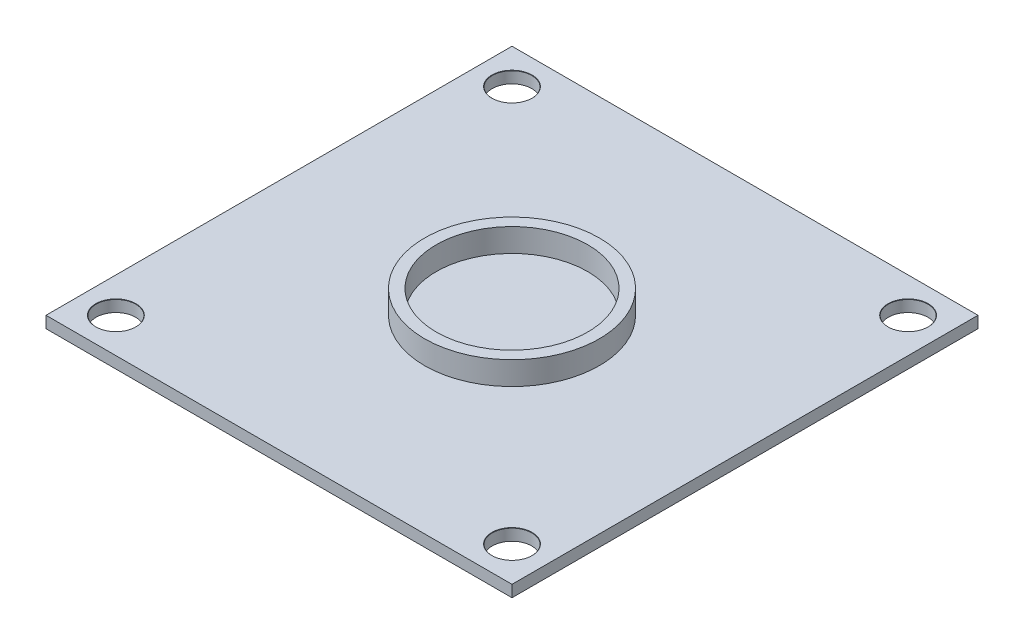
ISO-10303-21;
HEADER;
FILE_DESCRIPTION(('STEP AP214'),'2;1');
FILE_NAME('part.step','',(''),(''),'','','');
FILE_SCHEMA(('AUTOMOTIVE_DESIGN { 1 0 10303 214 1 1 1 1 }'));
ENDSEC;
DATA;
#1=APPLICATION_CONTEXT('core data for automotive mechanical design processes');
#2=APPLICATION_PROTOCOL_DEFINITION('international standard','automotive_design',2000,#1);
#3=PRODUCT_CONTEXT('',#1,'mechanical');
#4=PRODUCT('Part','Part','',(#3));
#5=PRODUCT_RELATED_PRODUCT_CATEGORY('part','',(#4));
#6=PRODUCT_DEFINITION_FORMATION('','',#4);
#7=PRODUCT_DEFINITION_CONTEXT('part definition',#1,'design');
#8=PRODUCT_DEFINITION('design','',#6,#7);
#9=PRODUCT_DEFINITION_SHAPE('','',#8);
#10=(LENGTH_UNIT() NAMED_UNIT(*) SI_UNIT(.MILLI.,.METRE.));
#11=(NAMED_UNIT(*) PLANE_ANGLE_UNIT() SI_UNIT($,.RADIAN.));
#12=(NAMED_UNIT(*) SI_UNIT($,.STERADIAN.) SOLID_ANGLE_UNIT());
#13=UNCERTAINTY_MEASURE_WITH_UNIT(LENGTH_MEASURE(1.E-05),#10,'distance_accuracy_value','');
#14=(GEOMETRIC_REPRESENTATION_CONTEXT(3) GLOBAL_UNCERTAINTY_ASSIGNED_CONTEXT((#13)) GLOBAL_UNIT_ASSIGNED_CONTEXT((#10,
#11,#12)) REPRESENTATION_CONTEXT('',''));
#15=CARTESIAN_POINT('',(0.,0.,0.));
#16=DIRECTION('',(0.,0.,1.));
#17=DIRECTION('',(1.,0.,0.));
#18=AXIS2_PLACEMENT_3D('',#15,#16,#17);
#19=CARTESIAN_POINT('',(0.,1.,0.));
#20=DIRECTION('',(1.,0.,0.));
#21=DIRECTION('',(0.,0.,-1.));
#22=AXIS2_PLACEMENT_3D('',#19,#20,#21);
#23=PLANE('',#22);
#24=DIRECTION('',(0.,0.,1.));
#25=VECTOR('',#24,1.);
#26=CARTESIAN_POINT('',(0.,0.,0.));
#27=LINE('',#26,#25);
#28=CARTESIAN_POINT('',(0.,0.,-40.));
#29=VERTEX_POINT('',#28);
#30=CARTESIAN_POINT('',(0.,0.,0.));
#31=VERTEX_POINT('',#30);
#32=EDGE_CURVE('E112',#29,#31,#27,.T.);
#33=ORIENTED_EDGE('',*,*,#32,.T.);
#34=DIRECTION('',(0.,-1.,0.));
#35=VECTOR('',#34,1.);
#36=CARTESIAN_POINT('',(0.,1.,0.));
#37=LINE('',#36,#35);
#38=CARTESIAN_POINT('',(0.,1.,0.));
#39=VERTEX_POINT('',#38);
#40=EDGE_CURVE('E50',#39,#31,#37,.T.);
#41=ORIENTED_EDGE('',*,*,#40,.F.);
#42=DIRECTION('',(0.,0.,1.));
#43=VECTOR('',#42,1.);
#44=CARTESIAN_POINT('',(0.,1.,0.));
#45=LINE('',#44,#43);
#46=CARTESIAN_POINT('',(0.,1.,-40.));
#47=VERTEX_POINT('',#46);
#48=EDGE_CURVE('E94',#47,#39,#45,.T.);
#49=ORIENTED_EDGE('',*,*,#48,.F.);
#50=DIRECTION('',(0.,-1.,0.));
#51=VECTOR('',#50,1.);
#52=CARTESIAN_POINT('',(0.,1.,-40.));
#53=LINE('',#52,#51);
#54=EDGE_CURVE('E108',#47,#29,#53,.T.);
#55=ORIENTED_EDGE('',*,*,#54,.T.);
#56=EDGE_LOOP('',(#33,#41,#49,#55));
#57=FACE_BOUND('',#56,.T.);
#58=ADVANCED_FACE('F41',(#57),#23,.F.);
#59=CARTESIAN_POINT('',(0.,1.,0.));
#60=DIRECTION('',(0.,0.,-1.));
#61=DIRECTION('',(-1.,0.,0.));
#62=AXIS2_PLACEMENT_3D('',#59,#60,#61);
#63=PLANE('',#62);
#64=DIRECTION('',(1.,0.,0.));
#65=VECTOR('',#64,1.);
#66=CARTESIAN_POINT('',(0.,0.,0.));
#67=LINE('',#66,#65);
#68=CARTESIAN_POINT('',(40.,0.,0.));
#69=VERTEX_POINT('',#68);
#70=EDGE_CURVE('E100',#31,#69,#67,.T.);
#71=ORIENTED_EDGE('',*,*,#70,.T.);
#72=DIRECTION('',(0.,-1.,0.));
#73=VECTOR('',#72,1.);
#74=CARTESIAN_POINT('',(40.,1.,0.));
#75=LINE('',#74,#73);
#76=CARTESIAN_POINT('',(40.,1.,0.));
#77=VERTEX_POINT('',#76);
#78=EDGE_CURVE('E98',#77,#69,#75,.T.);
#79=ORIENTED_EDGE('',*,*,#78,.F.);
#80=DIRECTION('',(1.,0.,0.));
#81=VECTOR('',#80,1.);
#82=CARTESIAN_POINT('',(0.,1.,0.));
#83=LINE('',#82,#81);
#84=EDGE_CURVE('E89',#39,#77,#83,.T.);
#85=ORIENTED_EDGE('',*,*,#84,.F.);
#86=ORIENTED_EDGE('',*,*,#40,.T.);
#87=EDGE_LOOP('',(#71,#79,#85,#86));
#88=FACE_BOUND('',#87,.T.);
#89=ADVANCED_FACE('F99',(#88),#63,.F.);
#90=CARTESIAN_POINT('',(40.,1.,0.));
#91=DIRECTION('',(-1.,0.,0.));
#92=DIRECTION('',(0.,0.,1.));
#93=AXIS2_PLACEMENT_3D('',#90,#91,#92);
#94=PLANE('',#93);
#95=DIRECTION('',(0.,0.,-1.));
#96=VECTOR('',#95,1.);
#97=CARTESIAN_POINT('',(40.,0.,0.));
#98=LINE('',#97,#96);
#99=CARTESIAN_POINT('',(40.,0.,-40.));
#100=VERTEX_POINT('',#99);
#101=EDGE_CURVE('E75',#69,#100,#98,.T.);
#102=ORIENTED_EDGE('',*,*,#101,.T.);
#103=DIRECTION('',(0.,-1.,0.));
#104=VECTOR('',#103,1.);
#105=CARTESIAN_POINT('',(40.,1.,-40.));
#106=LINE('',#105,#104);
#107=CARTESIAN_POINT('',(40.,1.,-40.));
#108=VERTEX_POINT('',#107);
#109=EDGE_CURVE('E102',#108,#100,#106,.T.);
#110=ORIENTED_EDGE('',*,*,#109,.F.);
#111=DIRECTION('',(0.,0.,-1.));
#112=VECTOR('',#111,1.);
#113=CARTESIAN_POINT('',(40.,1.,0.));
#114=LINE('',#113,#112);
#115=EDGE_CURVE('E92',#77,#108,#114,.T.);
#116=ORIENTED_EDGE('',*,*,#115,.F.);
#117=ORIENTED_EDGE('',*,*,#78,.T.);
#118=EDGE_LOOP('',(#102,#110,#116,#117));
#119=FACE_BOUND('',#118,.T.);
#120=ADVANCED_FACE('F104',(#119),#94,.F.);
#121=CARTESIAN_POINT('',(0.,1.,-40.));
#122=DIRECTION('',(0.,0.,1.));
#123=DIRECTION('',(1.,0.,0.));
#124=AXIS2_PLACEMENT_3D('',#121,#122,#123);
#125=PLANE('',#124);
#126=DIRECTION('',(-1.,0.,0.));
#127=VECTOR('',#126,1.);
#128=CARTESIAN_POINT('',(0.,0.,-40.));
#129=LINE('',#128,#127);
#130=EDGE_CURVE('E81',#100,#29,#129,.T.);
#131=ORIENTED_EDGE('',*,*,#130,.T.);
#132=ORIENTED_EDGE('',*,*,#54,.F.);
#133=DIRECTION('',(-1.,0.,0.));
#134=VECTOR('',#133,1.);
#135=CARTESIAN_POINT('',(0.,1.,-40.));
#136=LINE('',#135,#134);
#137=EDGE_CURVE('E58',#108,#47,#136,.T.);
#138=ORIENTED_EDGE('',*,*,#137,.F.);
#139=ORIENTED_EDGE('',*,*,#109,.T.);
#140=EDGE_LOOP('',(#131,#132,#138,#139));
#141=FACE_BOUND('',#140,.T.);
#142=ADVANCED_FACE('F142',(#141),#125,.F.);
#143=CARTESIAN_POINT('',(0.,1.,0.));
#144=DIRECTION('',(0.,-1.,0.));
#145=DIRECTION('',(0.,0.,-1.));
#146=AXIS2_PLACEMENT_3D('',#143,#144,#145);
#147=PLANE('',#146);
#148=CARTESIAN_POINT('',(3.,1.,-3.));
#149=DIRECTION('',(0.,1.,0.));
#150=DIRECTION('',(0.,0.,1.));
#151=AXIS2_PLACEMENT_3D('',#148,#149,#150);
#152=CIRCLE('',#151,1.725);
#153=CARTESIAN_POINT('',(3.,1.,-1.275));
#154=VERTEX_POINT('',#153);
#155=EDGE_CURVE('E332',#154,#154,#152,.T.);
#156=ORIENTED_EDGE('',*,*,#155,.F.);
#157=EDGE_LOOP('',(#156));
#158=FACE_BOUND('',#157,.T.);
#159=CARTESIAN_POINT('',(2.99999999999998,1.,-37.));
#160=DIRECTION('',(0.,1.,0.));
#161=DIRECTION('',(0.,0.,1.));
#162=AXIS2_PLACEMENT_3D('',#159,#160,#161);
#163=CIRCLE('',#162,1.725);
#164=CARTESIAN_POINT('',(2.99999999999998,1.,-35.275));
#165=VERTEX_POINT('',#164);
#166=EDGE_CURVE('E321',#165,#165,#163,.T.);
#167=ORIENTED_EDGE('',*,*,#166,.F.);
#168=EDGE_LOOP('',(#167));
#169=FACE_BOUND('',#168,.T.);
#170=CARTESIAN_POINT('',(37.,1.,-37.));
#171=DIRECTION('',(0.,1.,0.));
#172=DIRECTION('',(0.,0.,1.));
#173=AXIS2_PLACEMENT_3D('',#170,#171,#172);
#174=CIRCLE('',#173,1.725);
#175=CARTESIAN_POINT('',(37.,1.,-35.275));
#176=VERTEX_POINT('',#175);
#177=EDGE_CURVE('E309',#176,#176,#174,.T.);
#178=ORIENTED_EDGE('',*,*,#177,.F.);
#179=EDGE_LOOP('',(#178));
#180=FACE_BOUND('',#179,.T.);
#181=CARTESIAN_POINT('',(37.,1.,-3.00000000000002));
#182=DIRECTION('',(0.,1.,0.));
#183=DIRECTION('',(0.,0.,1.));
#184=AXIS2_PLACEMENT_3D('',#181,#182,#183);
#185=CIRCLE('',#184,1.725);
#186=CARTESIAN_POINT('',(37.,1.,-1.27500000000002));
#187=VERTEX_POINT('',#186);
#188=EDGE_CURVE('E297',#187,#187,#185,.T.);
#189=ORIENTED_EDGE('',*,*,#188,.F.);
#190=EDGE_LOOP('',(#189));
#191=FACE_BOUND('',#190,.T.);
#192=CARTESIAN_POINT('',(20.,1.,-20.));
#193=DIRECTION('',(0.,-1.,0.));
#194=DIRECTION('',(0.,0.,-1.));
#195=AXIS2_PLACEMENT_3D('',#192,#193,#194);
#196=CIRCLE('',#195,7.5);
#197=CARTESIAN_POINT('',(20.,1.,-27.5));
#198=VERTEX_POINT('',#197);
#199=EDGE_CURVE('E11',#198,#198,#196,.F.);
#200=ORIENTED_EDGE('',*,*,#199,.F.);
#201=EDGE_LOOP('',(#200));
#202=FACE_BOUND('',#201,.T.);
#203=ORIENTED_EDGE('',*,*,#48,.T.);
#204=ORIENTED_EDGE('',*,*,#84,.T.);
#205=ORIENTED_EDGE('',*,*,#115,.T.);
#206=ORIENTED_EDGE('',*,*,#137,.T.);
#207=EDGE_LOOP('',(#203,#204,#205,#206));
#208=FACE_BOUND('',#207,.T.);
#209=ADVANCED_FACE('F90',(#158,#169,#180,#191,#202,#208),#147,.F.);
#210=CARTESIAN_POINT('',(0.,0.,0.));
#211=DIRECTION('',(0.,-1.,0.));
#212=DIRECTION('',(0.,0.,-1.));
#213=AXIS2_PLACEMENT_3D('',#210,#211,#212);
#214=PLANE('',#213);
#215=CARTESIAN_POINT('',(3.,0.,-3.));
#216=DIRECTION('',(0.,1.,0.));
#217=DIRECTION('',(0.,0.,1.));
#218=AXIS2_PLACEMENT_3D('',#215,#216,#217);
#219=CIRCLE('',#218,1.7);
#220=CARTESIAN_POINT('',(3.,0.,-1.3));
#221=VERTEX_POINT('',#220);
#222=EDGE_CURVE('E325',#221,#221,#219,.T.);
#223=ORIENTED_EDGE('',*,*,#222,.T.);
#224=EDGE_LOOP('',(#223));
#225=FACE_BOUND('',#224,.T.);
#226=CARTESIAN_POINT('',(2.99999999999998,0.,-37.));
#227=DIRECTION('',(0.,1.,0.));
#228=DIRECTION('',(0.,0.,1.));
#229=AXIS2_PLACEMENT_3D('',#226,#227,#228);
#230=CIRCLE('',#229,1.7);
#231=CARTESIAN_POINT('',(2.99999999999998,0.,-35.3));
#232=VERTEX_POINT('',#231);
#233=EDGE_CURVE('E313',#232,#232,#230,.T.);
#234=ORIENTED_EDGE('',*,*,#233,.T.);
#235=EDGE_LOOP('',(#234));
#236=FACE_BOUND('',#235,.T.);
#237=CARTESIAN_POINT('',(37.,0.,-37.));
#238=DIRECTION('',(0.,1.,0.));
#239=DIRECTION('',(0.,0.,1.));
#240=AXIS2_PLACEMENT_3D('',#237,#238,#239);
#241=CIRCLE('',#240,1.7);
#242=CARTESIAN_POINT('',(37.,0.,-35.3));
#243=VERTEX_POINT('',#242);
#244=EDGE_CURVE('E301',#243,#243,#241,.T.);
#245=ORIENTED_EDGE('',*,*,#244,.T.);
#246=EDGE_LOOP('',(#245));
#247=FACE_BOUND('',#246,.T.);
#248=CARTESIAN_POINT('',(37.,0.,-3.00000000000002));
#249=DIRECTION('',(0.,1.,0.));
#250=DIRECTION('',(0.,0.,1.));
#251=AXIS2_PLACEMENT_3D('',#248,#249,#250);
#252=CIRCLE('',#251,1.7);
#253=CARTESIAN_POINT('',(37.,0.,-1.30000000000002));
#254=VERTEX_POINT('',#253);
#255=EDGE_CURVE('E288',#254,#254,#252,.T.);
#256=ORIENTED_EDGE('',*,*,#255,.T.);
#257=EDGE_LOOP('',(#256));
#258=FACE_BOUND('',#257,.T.);
#259=ORIENTED_EDGE('',*,*,#32,.F.);
#260=ORIENTED_EDGE('',*,*,#130,.F.);
#261=ORIENTED_EDGE('',*,*,#101,.F.);
#262=ORIENTED_EDGE('',*,*,#70,.F.);
#263=EDGE_LOOP('',(#259,#260,#261,#262));
#264=FACE_BOUND('',#263,.T.);
#265=ADVANCED_FACE('F130',(#225,#236,#247,#258,#264),#214,.T.);
#266=CARTESIAN_POINT('',(20.,3.,-20.));
#267=DIRECTION('',(0.,1.,0.));
#268=DIRECTION('',(0.,0.,1.));
#269=AXIS2_PLACEMENT_3D('',#266,#267,#268);
#270=PLANE('',#269);
#271=CARTESIAN_POINT('',(20.,3.,-20.));
#272=DIRECTION('',(0.,1.,0.));
#273=DIRECTION('',(0.,0.,1.));
#274=AXIS2_PLACEMENT_3D('',#271,#272,#273);
#275=CIRCLE('',#274,7.5);
#276=CARTESIAN_POINT('',(20.,3.,-12.5));
#277=VERTEX_POINT('',#276);
#278=EDGE_CURVE('E116',#277,#277,#275,.T.);
#279=ORIENTED_EDGE('',*,*,#278,.T.);
#280=EDGE_LOOP('',(#279));
#281=FACE_BOUND('',#280,.T.);
#282=CARTESIAN_POINT('',(20.,3.,-20.));
#283=DIRECTION('',(0.,1.,0.));
#284=DIRECTION('',(0.,0.,1.));
#285=AXIS2_PLACEMENT_3D('',#282,#283,#284);
#286=CIRCLE('',#285,6.50000000000001);
#287=CARTESIAN_POINT('',(20.,3.,-13.5));
#288=VERTEX_POINT('',#287);
#289=EDGE_CURVE('E278',#288,#288,#286,.T.);
#290=ORIENTED_EDGE('',*,*,#289,.F.);
#291=EDGE_LOOP('',(#290));
#292=FACE_BOUND('',#291,.T.);
#293=ADVANCED_FACE('F132',(#281,#292),#270,.T.);
#294=CARTESIAN_POINT('',(20.,3.,-20.));
#295=DIRECTION('',(0.,-1.,0.));
#296=DIRECTION('',(0.,0.,-1.));
#297=AXIS2_PLACEMENT_3D('',#294,#295,#296);
#298=CYLINDRICAL_SURFACE('',#297,7.5);
#299=ORIENTED_EDGE('',*,*,#278,.F.);
#300=EDGE_LOOP('',(#299));
#301=FACE_BOUND('',#300,.T.);
#302=ORIENTED_EDGE('',*,*,#199,.T.);
#303=EDGE_LOOP('',(#302));
#304=FACE_BOUND('',#303,.T.);
#305=ADVANCED_FACE('F139',(#301,#304),#298,.T.);
#306=CARTESIAN_POINT('',(20.,3.,-20.));
#307=DIRECTION('',(0.,-1.,0.));
#308=DIRECTION('',(0.,0.,-1.));
#309=AXIS2_PLACEMENT_3D('',#306,#307,#308);
#310=CYLINDRICAL_SURFACE('',#309,6.50000000000001);
#311=ORIENTED_EDGE('',*,*,#289,.T.);
#312=EDGE_LOOP('',(#311));
#313=FACE_BOUND('',#312,.T.);
#314=CARTESIAN_POINT('',(20.,1.,-20.));
#315=DIRECTION('',(0.,1.,0.));
#316=DIRECTION('',(0.,0.,1.));
#317=AXIS2_PLACEMENT_3D('',#314,#315,#316);
#318=CIRCLE('',#317,6.50000000000001);
#319=CARTESIAN_POINT('',(20.,1.,-13.5));
#320=VERTEX_POINT('',#319);
#321=EDGE_CURVE('E282',#320,#320,#318,.T.);
#322=ORIENTED_EDGE('',*,*,#321,.F.);
#323=EDGE_LOOP('',(#322));
#324=FACE_BOUND('',#323,.T.);
#325=ADVANCED_FACE('F264',(#313,#324),#310,.F.);
#326=ORIENTED_EDGE('',*,*,#321,.T.);
#327=EDGE_LOOP('',(#326));
#328=FACE_BOUND('',#327,.T.);
#329=ADVANCED_FACE('F145',(#328),#147,.F.);
#330=CARTESIAN_POINT('',(37.,1.,-3.00000000000002));
#331=DIRECTION('',(0.,1.,0.));
#332=DIRECTION('',(0.,0.,1.));
#333=AXIS2_PLACEMENT_3D('',#330,#331,#332);
#334=CYLINDRICAL_SURFACE('',#333,1.7);
#335=ORIENTED_EDGE('',*,*,#255,.F.);
#336=EDGE_LOOP('',(#335));
#337=FACE_BOUND('',#336,.T.);
#338=CARTESIAN_POINT('',(37.,0.974999999999999,-3.00000000000002));
#339=DIRECTION('',(0.,1.,0.));
#340=DIRECTION('',(0.,0.,1.));
#341=AXIS2_PLACEMENT_3D('',#338,#339,#340);
#342=CIRCLE('',#341,1.7);
#343=CARTESIAN_POINT('',(37.,0.974999999999999,-1.30000000000002));
#344=VERTEX_POINT('',#343);
#345=EDGE_CURVE('E293',#344,#344,#342,.T.);
#346=ORIENTED_EDGE('',*,*,#345,.T.);
#347=EDGE_LOOP('',(#346));
#348=FACE_BOUND('',#347,.T.);
#349=ADVANCED_FACE('F181',(#337,#348),#334,.F.);
#350=CARTESIAN_POINT('',(37.,1.,-3.00000000000002));
#351=DIRECTION('',(0.,1.,0.));
#352=DIRECTION('',(0.,0.,1.));
#353=AXIS2_PLACEMENT_3D('',#350,#351,#352);
#354=CONICAL_SURFACE('',#353,1.725,0.785398163397372);
#355=ORIENTED_EDGE('',*,*,#345,.F.);
#356=EDGE_LOOP('',(#355));
#357=FACE_BOUND('',#356,.T.);
#358=ORIENTED_EDGE('',*,*,#188,.T.);
#359=EDGE_LOOP('',(#358));
#360=FACE_BOUND('',#359,.T.);
#361=ADVANCED_FACE('F186',(#357,#360),#354,.F.);
#362=CARTESIAN_POINT('',(37.,1.,-37.));
#363=DIRECTION('',(0.,1.,0.));
#364=DIRECTION('',(0.,0.,1.));
#365=AXIS2_PLACEMENT_3D('',#362,#363,#364);
#366=CYLINDRICAL_SURFACE('',#365,1.7);
#367=ORIENTED_EDGE('',*,*,#244,.F.);
#368=EDGE_LOOP('',(#367));
#369=FACE_BOUND('',#368,.T.);
#370=CARTESIAN_POINT('',(37.,0.974999999999999,-37.));
#371=DIRECTION('',(0.,1.,0.));
#372=DIRECTION('',(0.,0.,1.));
#373=AXIS2_PLACEMENT_3D('',#370,#371,#372);
#374=CIRCLE('',#373,1.7);
#375=CARTESIAN_POINT('',(37.,0.974999999999999,-35.3));
#376=VERTEX_POINT('',#375);
#377=EDGE_CURVE('E305',#376,#376,#374,.T.);
#378=ORIENTED_EDGE('',*,*,#377,.T.);
#379=EDGE_LOOP('',(#378));
#380=FACE_BOUND('',#379,.T.);
#381=ADVANCED_FACE('F197',(#369,#380),#366,.F.);
#382=CARTESIAN_POINT('',(37.,1.,-37.));
#383=DIRECTION('',(0.,1.,0.));
#384=DIRECTION('',(0.,0.,1.));
#385=AXIS2_PLACEMENT_3D('',#382,#383,#384);
#386=CONICAL_SURFACE('',#385,1.725,0.785398163397372);
#387=ORIENTED_EDGE('',*,*,#377,.F.);
#388=EDGE_LOOP('',(#387));
#389=FACE_BOUND('',#388,.T.);
#390=ORIENTED_EDGE('',*,*,#177,.T.);
#391=EDGE_LOOP('',(#390));
#392=FACE_BOUND('',#391,.T.);
#393=ADVANCED_FACE('F207',(#389,#392),#386,.F.);
#394=CARTESIAN_POINT('',(2.99999999999998,1.,-37.));
#395=DIRECTION('',(0.,1.,0.));
#396=DIRECTION('',(0.,0.,1.));
#397=AXIS2_PLACEMENT_3D('',#394,#395,#396);
#398=CYLINDRICAL_SURFACE('',#397,1.7);
#399=ORIENTED_EDGE('',*,*,#233,.F.);
#400=EDGE_LOOP('',(#399));
#401=FACE_BOUND('',#400,.T.);
#402=CARTESIAN_POINT('',(2.99999999999998,0.974999999999999,-37.));
#403=DIRECTION('',(0.,1.,0.));
#404=DIRECTION('',(0.,0.,1.));
#405=AXIS2_PLACEMENT_3D('',#402,#403,#404);
#406=CIRCLE('',#405,1.7);
#407=CARTESIAN_POINT('',(2.99999999999998,0.974999999999999,-35.3));
#408=VERTEX_POINT('',#407);
#409=EDGE_CURVE('E317',#408,#408,#406,.T.);
#410=ORIENTED_EDGE('',*,*,#409,.T.);
#411=EDGE_LOOP('',(#410));
#412=FACE_BOUND('',#411,.T.);
#413=ADVANCED_FACE('F217',(#401,#412),#398,.F.);
#414=CARTESIAN_POINT('',(2.99999999999998,1.,-37.));
#415=DIRECTION('',(0.,1.,0.));
#416=DIRECTION('',(0.,0.,1.));
#417=AXIS2_PLACEMENT_3D('',#414,#415,#416);
#418=CONICAL_SURFACE('',#417,1.725,0.785398163397442);
#419=ORIENTED_EDGE('',*,*,#409,.F.);
#420=EDGE_LOOP('',(#419));
#421=FACE_BOUND('',#420,.T.);
#422=ORIENTED_EDGE('',*,*,#166,.T.);
#423=EDGE_LOOP('',(#422));
#424=FACE_BOUND('',#423,.T.);
#425=ADVANCED_FACE('F227',(#421,#424),#418,.F.);
#426=CARTESIAN_POINT('',(3.,1.,-3.));
#427=DIRECTION('',(0.,1.,0.));
#428=DIRECTION('',(0.,0.,1.));
#429=AXIS2_PLACEMENT_3D('',#426,#427,#428);
#430=CYLINDRICAL_SURFACE('',#429,1.7);
#431=ORIENTED_EDGE('',*,*,#222,.F.);
#432=EDGE_LOOP('',(#431));
#433=FACE_BOUND('',#432,.T.);
#434=CARTESIAN_POINT('',(3.,0.974999999999999,-3.));
#435=DIRECTION('',(0.,1.,0.));
#436=DIRECTION('',(0.,0.,1.));
#437=AXIS2_PLACEMENT_3D('',#434,#435,#436);
#438=CIRCLE('',#437,1.7);
#439=CARTESIAN_POINT('',(3.,0.974999999999999,-1.3));
#440=VERTEX_POINT('',#439);
#441=EDGE_CURVE('E328',#440,#440,#438,.T.);
#442=ORIENTED_EDGE('',*,*,#441,.T.);
#443=EDGE_LOOP('',(#442));
#444=FACE_BOUND('',#443,.T.);
#445=ADVANCED_FACE('F237',(#433,#444),#430,.F.);
#446=CARTESIAN_POINT('',(3.,1.,-3.));
#447=DIRECTION('',(0.,1.,0.));
#448=DIRECTION('',(0.,0.,1.));
#449=AXIS2_PLACEMENT_3D('',#446,#447,#448);
#450=CONICAL_SURFACE('',#449,1.725,0.785398163397442);
#451=ORIENTED_EDGE('',*,*,#441,.F.);
#452=EDGE_LOOP('',(#451));
#453=FACE_BOUND('',#452,.T.);
#454=ORIENTED_EDGE('',*,*,#155,.T.);
#455=EDGE_LOOP('',(#454));
#456=FACE_BOUND('',#455,.T.);
#457=ADVANCED_FACE('F247',(#453,#456),#450,.F.);
#458=CLOSED_SHELL('',(#58,#89,#120,#142,#209,#265,#293,#305,#325,#329,#349,#361,#381,#393,#413,
#425,#445,#457));
#459=MANIFOLD_SOLID_BREP('B2',#458);
#460=ADVANCED_BREP_SHAPE_REPRESENTATION('',(#18,#459),#14);
#461=SHAPE_DEFINITION_REPRESENTATION(#9,#460);
ENDSEC;
END-ISO-10303-21;
